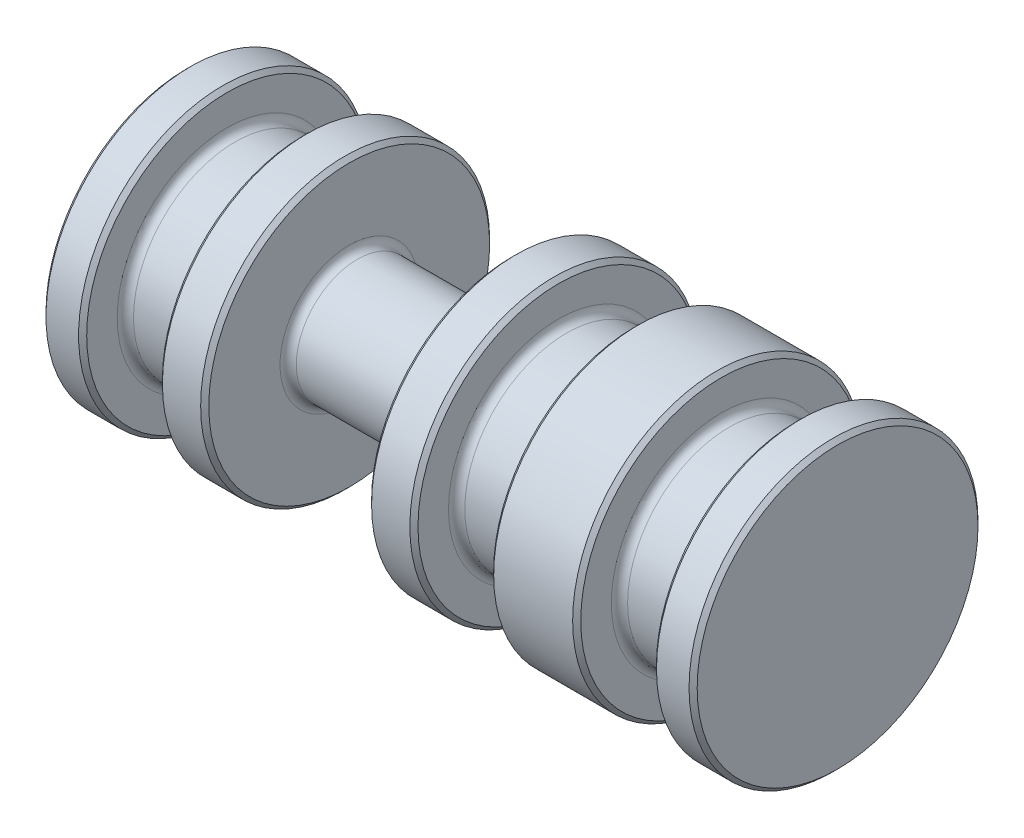
ISO-10303-21;
HEADER;
FILE_DESCRIPTION(('STEP AP214'),'2;1');
FILE_NAME('part.step','',(''),(''),'','','');
FILE_SCHEMA(('AUTOMOTIVE_DESIGN { 1 0 10303 214 1 1 1 1 }'));
ENDSEC;
DATA;
#1=APPLICATION_CONTEXT('core data for automotive mechanical design processes');
#2=APPLICATION_PROTOCOL_DEFINITION('international standard','automotive_design',2000,#1);
#3=PRODUCT_CONTEXT('',#1,'mechanical');
#4=PRODUCT('Part','Part','',(#3));
#5=PRODUCT_RELATED_PRODUCT_CATEGORY('part','',(#4));
#6=PRODUCT_DEFINITION_FORMATION('','',#4);
#7=PRODUCT_DEFINITION_CONTEXT('part definition',#1,'design');
#8=PRODUCT_DEFINITION('design','',#6,#7);
#9=PRODUCT_DEFINITION_SHAPE('','',#8);
#10=(LENGTH_UNIT() NAMED_UNIT(*) SI_UNIT(.MILLI.,.METRE.));
#11=(NAMED_UNIT(*) PLANE_ANGLE_UNIT() SI_UNIT($,.RADIAN.));
#12=(NAMED_UNIT(*) SI_UNIT($,.STERADIAN.) SOLID_ANGLE_UNIT());
#13=UNCERTAINTY_MEASURE_WITH_UNIT(LENGTH_MEASURE(1.E-05),#10,'distance_accuracy_value','');
#14=(GEOMETRIC_REPRESENTATION_CONTEXT(3) GLOBAL_UNCERTAINTY_ASSIGNED_CONTEXT((#13)) GLOBAL_UNIT_ASSIGNED_CONTEXT((#10,
#11,#12)) REPRESENTATION_CONTEXT('',''));
#15=CARTESIAN_POINT('',(0.,0.,0.));
#16=DIRECTION('',(0.,0.,1.));
#17=DIRECTION('',(1.,0.,0.));
#18=AXIS2_PLACEMENT_3D('',#15,#16,#17);
#19=CARTESIAN_POINT('',(20.32,0.,0.));
#20=DIRECTION('',(-1.,0.,0.));
#21=DIRECTION('',(0.,0.,1.));
#22=AXIS2_PLACEMENT_3D('',#19,#20,#21);
#23=CYLINDRICAL_SURFACE('',#22,4.5085);
#24=CARTESIAN_POINT('',(1.143,0.,0.));
#25=DIRECTION('',(1.,0.,0.));
#26=DIRECTION('',(0.,0.,-1.));
#27=AXIS2_PLACEMENT_3D('',#24,#25,#26);
#28=CIRCLE('',#27,4.5085);
#29=CARTESIAN_POINT('',(1.143,0.,-4.5085));
#30=VERTEX_POINT('',#29);
#31=EDGE_CURVE('E48',#30,#30,#28,.F.);
#32=ORIENTED_EDGE('',*,*,#31,.T.);
#33=EDGE_LOOP('',(#32));
#34=FACE_BOUND('',#33,.T.);
#35=CARTESIAN_POINT('',(0.126999999999999,0.,0.));
#36=DIRECTION('',(1.,0.,0.));
#37=DIRECTION('',(0.,0.,-1.));
#38=AXIS2_PLACEMENT_3D('',#35,#36,#37);
#39=CIRCLE('',#38,4.5085);
#40=CARTESIAN_POINT('',(0.126999999999999,0.,-4.5085));
#41=VERTEX_POINT('',#40);
#42=EDGE_CURVE('E92',#41,#41,#39,.T.);
#43=ORIENTED_EDGE('',*,*,#42,.T.);
#44=EDGE_LOOP('',(#43));
#45=FACE_BOUND('',#44,.T.);
#46=ADVANCED_FACE('F39',(#34,#45),#23,.T.);
#47=CARTESIAN_POINT('',(0.,0.,0.));
#48=DIRECTION('',(1.,0.,0.));
#49=DIRECTION('',(0.,0.,-1.));
#50=AXIS2_PLACEMENT_3D('',#47,#48,#49);
#51=PLANE('',#50);
#52=CARTESIAN_POINT('',(0.,0.,0.));
#53=DIRECTION('',(1.,0.,0.));
#54=DIRECTION('',(0.,0.,-1.));
#55=AXIS2_PLACEMENT_3D('',#52,#53,#54);
#56=CIRCLE('',#55,4.3815);
#57=CARTESIAN_POINT('',(0.,0.,-4.3815));
#58=VERTEX_POINT('',#57);
#59=EDGE_CURVE('E88',#58,#58,#56,.F.);
#60=ORIENTED_EDGE('',*,*,#59,.T.);
#61=EDGE_LOOP('',(#60));
#62=FACE_BOUND('',#61,.T.);
#63=ADVANCED_FACE('F222',(#62),#51,.F.);
#64=CARTESIAN_POINT('',(1.27,3.175,0.));
#65=DIRECTION('',(1.,0.,0.));
#66=DIRECTION('',(0.,0.,-1.));
#67=AXIS2_PLACEMENT_3D('',#64,#65,#66);
#68=PLANE('',#67);
#69=CARTESIAN_POINT('',(1.27,0.,0.));
#70=DIRECTION('',(1.,0.,0.));
#71=DIRECTION('',(0.,0.,-1.));
#72=AXIS2_PLACEMENT_3D('',#69,#70,#71);
#73=CIRCLE('',#72,4.3815);
#74=CARTESIAN_POINT('',(1.27,0.,-4.3815));
#75=VERTEX_POINT('',#74);
#76=EDGE_CURVE('E10',#75,#75,#73,.T.);
#77=ORIENTED_EDGE('',*,*,#76,.T.);
#78=EDGE_LOOP('',(#77));
#79=FACE_BOUND('',#78,.T.);
#80=CARTESIAN_POINT('',(1.27,0.,0.));
#81=DIRECTION('',(1.,0.,0.));
#82=DIRECTION('',(0.,0.,-1.));
#83=AXIS2_PLACEMENT_3D('',#80,#81,#82);
#84=CIRCLE('',#83,3.429);
#85=CARTESIAN_POINT('',(1.27,0.,-3.429));
#86=VERTEX_POINT('',#85);
#87=EDGE_CURVE('E128',#86,#86,#84,.F.);
#88=ORIENTED_EDGE('',*,*,#87,.T.);
#89=EDGE_LOOP('',(#88));
#90=FACE_BOUND('',#89,.T.);
#91=ADVANCED_FACE('F227',(#79,#90),#68,.T.);
#92=CARTESIAN_POINT('',(3.6322,4.5085,0.));
#93=DIRECTION('',(-1.,0.,0.));
#94=DIRECTION('',(0.,0.,1.));
#95=AXIS2_PLACEMENT_3D('',#92,#93,#94);
#96=PLANE('',#95);
#97=CARTESIAN_POINT('',(3.6322,0.,0.));
#98=DIRECTION('',(-1.,0.,0.));
#99=DIRECTION('',(0.,0.,1.));
#100=AXIS2_PLACEMENT_3D('',#97,#98,#99);
#101=CIRCLE('',#100,4.38150000000001);
#102=CARTESIAN_POINT('',(3.6322,0.,4.38150000000001));
#103=VERTEX_POINT('',#102);
#104=EDGE_CURVE('E100',#103,#103,#101,.T.);
#105=ORIENTED_EDGE('',*,*,#104,.T.);
#106=EDGE_LOOP('',(#105));
#107=FACE_BOUND('',#106,.T.);
#108=CARTESIAN_POINT('',(3.6322,0.,0.));
#109=DIRECTION('',(-1.,0.,0.));
#110=DIRECTION('',(0.,0.,1.));
#111=AXIS2_PLACEMENT_3D('',#108,#109,#110);
#112=CIRCLE('',#111,3.429);
#113=CARTESIAN_POINT('',(3.6322,0.,3.429));
#114=VERTEX_POINT('',#113);
#115=EDGE_CURVE('E132',#114,#114,#112,.F.);
#116=ORIENTED_EDGE('',*,*,#115,.T.);
#117=EDGE_LOOP('',(#116));
#118=FACE_BOUND('',#117,.T.);
#119=ADVANCED_FACE('F284',(#107,#118),#96,.T.);
#120=CARTESIAN_POINT('',(-1.61741962375833,0.,0.));
#121=DIRECTION('',(-1.,0.,0.));
#122=DIRECTION('',(0.,0.,1.));
#123=AXIS2_PLACEMENT_3D('',#120,#121,#122);
#124=CYLINDRICAL_SURFACE('',#123,3.175);
#125=CARTESIAN_POINT('',(3.3782,0.,0.));
#126=DIRECTION('',(-1.,0.,0.));
#127=DIRECTION('',(0.,0.,1.));
#128=AXIS2_PLACEMENT_3D('',#125,#126,#127);
#129=CIRCLE('',#128,3.175);
#130=CARTESIAN_POINT('',(3.3782,0.,3.175));
#131=VERTEX_POINT('',#130);
#132=EDGE_CURVE('E136',#131,#131,#129,.T.);
#133=ORIENTED_EDGE('',*,*,#132,.T.);
#134=EDGE_LOOP('',(#133));
#135=FACE_BOUND('',#134,.T.);
#136=CARTESIAN_POINT('',(1.524,0.,0.));
#137=DIRECTION('',(1.,0.,0.));
#138=DIRECTION('',(0.,0.,-1.));
#139=AXIS2_PLACEMENT_3D('',#136,#137,#138);
#140=CIRCLE('',#139,3.175);
#141=CARTESIAN_POINT('',(1.524,0.,-3.175));
#142=VERTEX_POINT('',#141);
#143=EDGE_CURVE('E140',#142,#142,#140,.T.);
#144=ORIENTED_EDGE('',*,*,#143,.T.);
#145=EDGE_LOOP('',(#144));
#146=FACE_BOUND('',#145,.T.);
#147=ADVANCED_FACE('F234',(#135,#146),#124,.T.);
#148=CARTESIAN_POINT('',(4.953,0.,0.));
#149=DIRECTION('',(1.,0.,0.));
#150=DIRECTION('',(0.,0.,-1.));
#151=AXIS2_PLACEMENT_3D('',#148,#149,#150);
#152=CIRCLE('',#151,4.5085);
#153=CARTESIAN_POINT('',(4.953,0.,-4.5085));
#154=VERTEX_POINT('',#153);
#155=EDGE_CURVE('E58',#154,#154,#152,.F.);
#156=ORIENTED_EDGE('',*,*,#155,.T.);
#157=EDGE_LOOP('',(#156));
#158=FACE_BOUND('',#157,.T.);
#159=CARTESIAN_POINT('',(3.7592,0.,0.));
#160=DIRECTION('',(-1.,0.,0.));
#161=DIRECTION('',(0.,0.,1.));
#162=AXIS2_PLACEMENT_3D('',#159,#160,#161);
#163=CIRCLE('',#162,4.5085);
#164=CARTESIAN_POINT('',(3.7592,0.,4.5085));
#165=VERTEX_POINT('',#164);
#166=EDGE_CURVE('E96',#165,#165,#163,.F.);
#167=ORIENTED_EDGE('',*,*,#166,.T.);
#168=EDGE_LOOP('',(#167));
#169=FACE_BOUND('',#168,.T.);
#170=ADVANCED_FACE('F219',(#158,#169),#23,.T.);
#171=CARTESIAN_POINT('',(5.08,4.5085,0.));
#172=DIRECTION('',(1.,0.,0.));
#173=DIRECTION('',(0.,0.,-1.));
#174=AXIS2_PLACEMENT_3D('',#171,#172,#173);
#175=PLANE('',#174);
#176=CARTESIAN_POINT('',(5.08,0.,0.));
#177=DIRECTION('',(1.,0.,0.));
#178=DIRECTION('',(0.,0.,-1.));
#179=AXIS2_PLACEMENT_3D('',#176,#177,#178);
#180=CIRCLE('',#179,4.3815);
#181=CARTESIAN_POINT('',(5.08,0.,-4.3815));
#182=VERTEX_POINT('',#181);
#183=EDGE_CURVE('E53',#182,#182,#180,.T.);
#184=ORIENTED_EDGE('',*,*,#183,.T.);
#185=EDGE_LOOP('',(#184));
#186=FACE_BOUND('',#185,.T.);
#187=CARTESIAN_POINT('',(5.08,0.,0.));
#188=DIRECTION('',(1.,0.,0.));
#189=DIRECTION('',(0.,0.,-1.));
#190=AXIS2_PLACEMENT_3D('',#187,#188,#189);
#191=CIRCLE('',#190,2.159);
#192=CARTESIAN_POINT('',(5.08,0.,-2.159));
#193=VERTEX_POINT('',#192);
#194=EDGE_CURVE('E144',#193,#193,#191,.F.);
#195=ORIENTED_EDGE('',*,*,#194,.T.);
#196=EDGE_LOOP('',(#195));
#197=FACE_BOUND('',#196,.T.);
#198=ADVANCED_FACE('F233',(#186,#197),#175,.T.);
#199=CARTESIAN_POINT('',(-1.61741962375833,0.,0.));
#200=DIRECTION('',(-1.,0.,0.));
#201=DIRECTION('',(0.,0.,1.));
#202=AXIS2_PLACEMENT_3D('',#199,#200,#201);
#203=CYLINDRICAL_SURFACE('',#202,1.905);
#204=CARTESIAN_POINT('',(9.906,0.,0.));
#205=DIRECTION('',(-1.,0.,0.));
#206=DIRECTION('',(0.,0.,1.));
#207=AXIS2_PLACEMENT_3D('',#204,#205,#206);
#208=CIRCLE('',#207,1.905);
#209=CARTESIAN_POINT('',(9.906,0.,1.905));
#210=VERTEX_POINT('',#209);
#211=EDGE_CURVE('E152',#210,#210,#208,.T.);
#212=ORIENTED_EDGE('',*,*,#211,.T.);
#213=EDGE_LOOP('',(#212));
#214=FACE_BOUND('',#213,.T.);
#215=CARTESIAN_POINT('',(5.334,0.,0.));
#216=DIRECTION('',(1.,0.,0.));
#217=DIRECTION('',(0.,0.,-1.));
#218=AXIS2_PLACEMENT_3D('',#215,#216,#217);
#219=CIRCLE('',#218,1.905);
#220=CARTESIAN_POINT('',(5.334,0.,-1.905));
#221=VERTEX_POINT('',#220);
#222=EDGE_CURVE('E156',#221,#221,#219,.T.);
#223=ORIENTED_EDGE('',*,*,#222,.T.);
#224=EDGE_LOOP('',(#223));
#225=FACE_BOUND('',#224,.T.);
#226=ADVANCED_FACE('F247',(#214,#225),#203,.T.);
#227=CARTESIAN_POINT('',(10.16,4.5085,0.));
#228=DIRECTION('',(-1.,0.,0.));
#229=DIRECTION('',(0.,0.,1.));
#230=AXIS2_PLACEMENT_3D('',#227,#228,#229);
#231=PLANE('',#230);
#232=CARTESIAN_POINT('',(10.16,0.,0.));
#233=DIRECTION('',(-1.,0.,0.));
#234=DIRECTION('',(0.,0.,1.));
#235=AXIS2_PLACEMENT_3D('',#232,#233,#234);
#236=CIRCLE('',#235,4.3815);
#237=CARTESIAN_POINT('',(10.16,0.,4.3815));
#238=VERTEX_POINT('',#237);
#239=EDGE_CURVE('E108',#238,#238,#236,.T.);
#240=ORIENTED_EDGE('',*,*,#239,.T.);
#241=EDGE_LOOP('',(#240));
#242=FACE_BOUND('',#241,.T.);
#243=CARTESIAN_POINT('',(10.16,0.,0.));
#244=DIRECTION('',(-1.,0.,0.));
#245=DIRECTION('',(0.,0.,1.));
#246=AXIS2_PLACEMENT_3D('',#243,#244,#245);
#247=CIRCLE('',#246,2.159);
#248=CARTESIAN_POINT('',(10.16,0.,2.159));
#249=VERTEX_POINT('',#248);
#250=EDGE_CURVE('E148',#249,#249,#247,.F.);
#251=ORIENTED_EDGE('',*,*,#250,.T.);
#252=EDGE_LOOP('',(#251));
#253=FACE_BOUND('',#252,.T.);
#254=ADVANCED_FACE('F238',(#242,#253),#231,.T.);
#255=CARTESIAN_POINT('',(11.4808,0.,0.));
#256=DIRECTION('',(1.,0.,0.));
#257=DIRECTION('',(0.,0.,-1.));
#258=AXIS2_PLACEMENT_3D('',#255,#256,#257);
#259=CIRCLE('',#258,4.5085);
#260=CARTESIAN_POINT('',(11.4808,0.,-4.5085));
#261=VERTEX_POINT('',#260);
#262=EDGE_CURVE('E68',#261,#261,#259,.F.);
#263=ORIENTED_EDGE('',*,*,#262,.T.);
#264=EDGE_LOOP('',(#263));
#265=FACE_BOUND('',#264,.T.);
#266=CARTESIAN_POINT('',(10.287,0.,0.));
#267=DIRECTION('',(-1.,0.,0.));
#268=DIRECTION('',(0.,0.,1.));
#269=AXIS2_PLACEMENT_3D('',#266,#267,#268);
#270=CIRCLE('',#269,4.5085);
#271=CARTESIAN_POINT('',(10.287,0.,4.5085));
#272=VERTEX_POINT('',#271);
#273=EDGE_CURVE('E104',#272,#272,#270,.F.);
#274=ORIENTED_EDGE('',*,*,#273,.T.);
#275=EDGE_LOOP('',(#274));
#276=FACE_BOUND('',#275,.T.);
#277=ADVANCED_FACE('F223',(#265,#276),#23,.T.);
#278=CARTESIAN_POINT('',(11.6078,3.175,0.));
#279=DIRECTION('',(1.,0.,0.));
#280=DIRECTION('',(0.,0.,-1.));
#281=AXIS2_PLACEMENT_3D('',#278,#279,#280);
#282=PLANE('',#281);
#283=CARTESIAN_POINT('',(11.6078,0.,0.));
#284=DIRECTION('',(1.,0.,0.));
#285=DIRECTION('',(0.,0.,-1.));
#286=AXIS2_PLACEMENT_3D('',#283,#284,#285);
#287=CIRCLE('',#286,4.38150000000001);
#288=CARTESIAN_POINT('',(11.6078,0.,-4.38150000000001));
#289=VERTEX_POINT('',#288);
#290=EDGE_CURVE('E64',#289,#289,#287,.T.);
#291=ORIENTED_EDGE('',*,*,#290,.T.);
#292=EDGE_LOOP('',(#291));
#293=FACE_BOUND('',#292,.T.);
#294=CARTESIAN_POINT('',(11.6078,0.,0.));
#295=DIRECTION('',(1.,0.,0.));
#296=DIRECTION('',(0.,0.,-1.));
#297=AXIS2_PLACEMENT_3D('',#294,#295,#296);
#298=CIRCLE('',#297,3.429);
#299=CARTESIAN_POINT('',(11.6078,0.,-3.429));
#300=VERTEX_POINT('',#299);
#301=EDGE_CURVE('E160',#300,#300,#298,.F.);
#302=ORIENTED_EDGE('',*,*,#301,.T.);
#303=EDGE_LOOP('',(#302));
#304=FACE_BOUND('',#303,.T.);
#305=ADVANCED_FACE('F237',(#293,#304),#282,.T.);
#306=CARTESIAN_POINT('',(13.97,4.5085,0.));
#307=DIRECTION('',(-1.,0.,0.));
#308=DIRECTION('',(0.,0.,1.));
#309=AXIS2_PLACEMENT_3D('',#306,#307,#308);
#310=PLANE('',#309);
#311=CARTESIAN_POINT('',(13.97,0.,0.));
#312=DIRECTION('',(-1.,0.,0.));
#313=DIRECTION('',(0.,0.,1.));
#314=AXIS2_PLACEMENT_3D('',#311,#312,#313);
#315=CIRCLE('',#314,4.3815);
#316=CARTESIAN_POINT('',(13.97,0.,4.3815));
#317=VERTEX_POINT('',#316);
#318=EDGE_CURVE('E116',#317,#317,#315,.T.);
#319=ORIENTED_EDGE('',*,*,#318,.T.);
#320=EDGE_LOOP('',(#319));
#321=FACE_BOUND('',#320,.T.);
#322=CARTESIAN_POINT('',(13.97,0.,0.));
#323=DIRECTION('',(-1.,0.,0.));
#324=DIRECTION('',(0.,0.,1.));
#325=AXIS2_PLACEMENT_3D('',#322,#323,#324);
#326=CIRCLE('',#325,3.429);
#327=CARTESIAN_POINT('',(13.97,0.,3.429));
#328=VERTEX_POINT('',#327);
#329=EDGE_CURVE('E164',#328,#328,#326,.F.);
#330=ORIENTED_EDGE('',*,*,#329,.T.);
#331=EDGE_LOOP('',(#330));
#332=FACE_BOUND('',#331,.T.);
#333=ADVANCED_FACE('F244',(#321,#332),#310,.T.);
#334=CARTESIAN_POINT('',(-1.61741962375833,0.,0.));
#335=DIRECTION('',(-1.,0.,0.));
#336=DIRECTION('',(0.,0.,1.));
#337=AXIS2_PLACEMENT_3D('',#334,#335,#336);
#338=CYLINDRICAL_SURFACE('',#337,3.175);
#339=CARTESIAN_POINT('',(13.716,0.,0.));
#340=DIRECTION('',(-1.,0.,0.));
#341=DIRECTION('',(0.,0.,1.));
#342=AXIS2_PLACEMENT_3D('',#339,#340,#341);
#343=CIRCLE('',#342,3.175);
#344=CARTESIAN_POINT('',(13.716,0.,3.175));
#345=VERTEX_POINT('',#344);
#346=EDGE_CURVE('E168',#345,#345,#343,.T.);
#347=ORIENTED_EDGE('',*,*,#346,.T.);
#348=EDGE_LOOP('',(#347));
#349=FACE_BOUND('',#348,.T.);
#350=CARTESIAN_POINT('',(11.8618,0.,0.));
#351=DIRECTION('',(1.,0.,0.));
#352=DIRECTION('',(0.,0.,-1.));
#353=AXIS2_PLACEMENT_3D('',#350,#351,#352);
#354=CIRCLE('',#353,3.175);
#355=CARTESIAN_POINT('',(11.8618,0.,-3.175));
#356=VERTEX_POINT('',#355);
#357=EDGE_CURVE('E172',#356,#356,#354,.T.);
#358=ORIENTED_EDGE('',*,*,#357,.T.);
#359=EDGE_LOOP('',(#358));
#360=FACE_BOUND('',#359,.T.);
#361=ADVANCED_FACE('F215',(#349,#360),#338,.T.);
#362=CARTESIAN_POINT('',(16.5608,0.,0.));
#363=DIRECTION('',(1.,0.,0.));
#364=DIRECTION('',(0.,0.,-1.));
#365=AXIS2_PLACEMENT_3D('',#362,#363,#364);
#366=CIRCLE('',#365,4.5085);
#367=CARTESIAN_POINT('',(16.5608,0.,-4.5085));
#368=VERTEX_POINT('',#367);
#369=EDGE_CURVE('E76',#368,#368,#366,.F.);
#370=ORIENTED_EDGE('',*,*,#369,.T.);
#371=EDGE_LOOP('',(#370));
#372=FACE_BOUND('',#371,.T.);
#373=CARTESIAN_POINT('',(14.097,0.,0.));
#374=DIRECTION('',(-1.,0.,0.));
#375=DIRECTION('',(0.,0.,1.));
#376=AXIS2_PLACEMENT_3D('',#373,#374,#375);
#377=CIRCLE('',#376,4.5085);
#378=CARTESIAN_POINT('',(14.097,0.,4.5085));
#379=VERTEX_POINT('',#378);
#380=EDGE_CURVE('E112',#379,#379,#377,.F.);
#381=ORIENTED_EDGE('',*,*,#380,.T.);
#382=EDGE_LOOP('',(#381));
#383=FACE_BOUND('',#382,.T.);
#384=ADVANCED_FACE('F206',(#372,#383),#23,.T.);
#385=CARTESIAN_POINT('',(16.6878,3.175,0.));
#386=DIRECTION('',(1.,0.,0.));
#387=DIRECTION('',(0.,0.,-1.));
#388=AXIS2_PLACEMENT_3D('',#385,#386,#387);
#389=PLANE('',#388);
#390=CARTESIAN_POINT('',(16.6878,0.,0.));
#391=DIRECTION('',(1.,0.,0.));
#392=DIRECTION('',(0.,0.,-1.));
#393=AXIS2_PLACEMENT_3D('',#390,#391,#392);
#394=CIRCLE('',#393,4.3815);
#395=CARTESIAN_POINT('',(16.6878,0.,-4.3815));
#396=VERTEX_POINT('',#395);
#397=EDGE_CURVE('E72',#396,#396,#394,.T.);
#398=ORIENTED_EDGE('',*,*,#397,.T.);
#399=EDGE_LOOP('',(#398));
#400=FACE_BOUND('',#399,.T.);
#401=CARTESIAN_POINT('',(16.6878,0.,0.));
#402=DIRECTION('',(1.,0.,0.));
#403=DIRECTION('',(0.,0.,-1.));
#404=AXIS2_PLACEMENT_3D('',#401,#402,#403);
#405=CIRCLE('',#404,3.429);
#406=CARTESIAN_POINT('',(16.6878,0.,-3.429));
#407=VERTEX_POINT('',#406);
#408=EDGE_CURVE('E176',#407,#407,#405,.F.);
#409=ORIENTED_EDGE('',*,*,#408,.T.);
#410=EDGE_LOOP('',(#409));
#411=FACE_BOUND('',#410,.T.);
#412=ADVANCED_FACE('F203',(#400,#411),#389,.T.);
#413=CARTESIAN_POINT('',(19.05,4.5085,0.));
#414=DIRECTION('',(-1.,0.,0.));
#415=DIRECTION('',(0.,0.,1.));
#416=AXIS2_PLACEMENT_3D('',#413,#414,#415);
#417=PLANE('',#416);
#418=CARTESIAN_POINT('',(19.05,0.,0.));
#419=DIRECTION('',(-1.,0.,0.));
#420=DIRECTION('',(0.,0.,1.));
#421=AXIS2_PLACEMENT_3D('',#418,#419,#420);
#422=CIRCLE('',#421,4.3815);
#423=CARTESIAN_POINT('',(19.05,0.,4.3815));
#424=VERTEX_POINT('',#423);
#425=EDGE_CURVE('E124',#424,#424,#422,.T.);
#426=ORIENTED_EDGE('',*,*,#425,.T.);
#427=EDGE_LOOP('',(#426));
#428=FACE_BOUND('',#427,.T.);
#429=CARTESIAN_POINT('',(19.05,0.,0.));
#430=DIRECTION('',(-1.,0.,0.));
#431=DIRECTION('',(0.,0.,1.));
#432=AXIS2_PLACEMENT_3D('',#429,#430,#431);
#433=CIRCLE('',#432,3.429);
#434=CARTESIAN_POINT('',(19.05,0.,3.429));
#435=VERTEX_POINT('',#434);
#436=EDGE_CURVE('E180',#435,#435,#433,.F.);
#437=ORIENTED_EDGE('',*,*,#436,.T.);
#438=EDGE_LOOP('',(#437));
#439=FACE_BOUND('',#438,.T.);
#440=ADVANCED_FACE('F205',(#428,#439),#417,.T.);
#441=CARTESIAN_POINT('',(-1.61741962375833,0.,0.));
#442=DIRECTION('',(-1.,0.,0.));
#443=DIRECTION('',(0.,0.,1.));
#444=AXIS2_PLACEMENT_3D('',#441,#442,#443);
#445=CYLINDRICAL_SURFACE('',#444,3.175);
#446=CARTESIAN_POINT('',(18.796,0.,0.));
#447=DIRECTION('',(-1.,0.,0.));
#448=DIRECTION('',(0.,0.,1.));
#449=AXIS2_PLACEMENT_3D('',#446,#447,#448);
#450=CIRCLE('',#449,3.175);
#451=CARTESIAN_POINT('',(18.796,0.,3.175));
#452=VERTEX_POINT('',#451);
#453=EDGE_CURVE('E184',#452,#452,#450,.T.);
#454=ORIENTED_EDGE('',*,*,#453,.T.);
#455=EDGE_LOOP('',(#454));
#456=FACE_BOUND('',#455,.T.);
#457=CARTESIAN_POINT('',(16.9418,0.,0.));
#458=DIRECTION('',(1.,0.,0.));
#459=DIRECTION('',(0.,0.,-1.));
#460=AXIS2_PLACEMENT_3D('',#457,#458,#459);
#461=CIRCLE('',#460,3.175);
#462=CARTESIAN_POINT('',(16.9418,0.,-3.175));
#463=VERTEX_POINT('',#462);
#464=EDGE_CURVE('E188',#463,#463,#461,.T.);
#465=ORIENTED_EDGE('',*,*,#464,.T.);
#466=EDGE_LOOP('',(#465));
#467=FACE_BOUND('',#466,.T.);
#468=ADVANCED_FACE('F193',(#456,#467),#445,.T.);
#469=CARTESIAN_POINT('',(20.32,0.,0.));
#470=DIRECTION('',(1.,0.,0.));
#471=DIRECTION('',(0.,0.,-1.));
#472=AXIS2_PLACEMENT_3D('',#469,#470,#471);
#473=PLANE('',#472);
#474=CARTESIAN_POINT('',(20.32,0.,0.));
#475=DIRECTION('',(1.,0.,0.));
#476=DIRECTION('',(0.,0.,-1.));
#477=AXIS2_PLACEMENT_3D('',#474,#475,#476);
#478=CIRCLE('',#477,4.3815);
#479=CARTESIAN_POINT('',(20.32,0.,-4.3815));
#480=VERTEX_POINT('',#479);
#481=EDGE_CURVE('E84',#480,#480,#478,.T.);
#482=ORIENTED_EDGE('',*,*,#481,.T.);
#483=EDGE_LOOP('',(#482));
#484=FACE_BOUND('',#483,.T.);
#485=ADVANCED_FACE('F252',(#484),#473,.T.);
#486=CARTESIAN_POINT('',(20.193,0.,0.));
#487=DIRECTION('',(1.,0.,0.));
#488=DIRECTION('',(0.,0.,-1.));
#489=AXIS2_PLACEMENT_3D('',#486,#487,#488);
#490=CIRCLE('',#489,4.5085);
#491=CARTESIAN_POINT('',(20.193,0.,-4.5085));
#492=VERTEX_POINT('',#491);
#493=EDGE_CURVE('E80',#492,#492,#490,.F.);
#494=ORIENTED_EDGE('',*,*,#493,.T.);
#495=EDGE_LOOP('',(#494));
#496=FACE_BOUND('',#495,.T.);
#497=CARTESIAN_POINT('',(19.177,0.,0.));
#498=DIRECTION('',(-1.,0.,0.));
#499=DIRECTION('',(0.,0.,1.));
#500=AXIS2_PLACEMENT_3D('',#497,#498,#499);
#501=CIRCLE('',#500,4.5085);
#502=CARTESIAN_POINT('',(19.177,0.,4.5085));
#503=VERTEX_POINT('',#502);
#504=EDGE_CURVE('E120',#503,#503,#501,.F.);
#505=ORIENTED_EDGE('',*,*,#504,.T.);
#506=EDGE_LOOP('',(#505));
#507=FACE_BOUND('',#506,.T.);
#508=ADVANCED_FACE('F218',(#496,#507),#23,.T.);
#509=CARTESIAN_POINT('',(18.796,0.,0.));
#510=DIRECTION('',(-1.,0.,0.));
#511=DIRECTION('',(0.,0.,1.));
#512=AXIS2_PLACEMENT_3D('',#509,#510,#511);
#513=TOROIDAL_SURFACE('',#512,3.429,0.254);
#514=ORIENTED_EDGE('',*,*,#436,.F.);
#515=EDGE_LOOP('',(#514));
#516=FACE_BOUND('',#515,.T.);
#517=ORIENTED_EDGE('',*,*,#453,.F.);
#518=EDGE_LOOP('',(#517));
#519=FACE_BOUND('',#518,.T.);
#520=ADVANCED_FACE('F199',(#516,#519),#513,.F.);
#521=CARTESIAN_POINT('',(16.9418,0.,0.));
#522=DIRECTION('',(1.,0.,0.));
#523=DIRECTION('',(0.,0.,-1.));
#524=AXIS2_PLACEMENT_3D('',#521,#522,#523);
#525=TOROIDAL_SURFACE('',#524,3.429,0.254);
#526=ORIENTED_EDGE('',*,*,#464,.F.);
#527=EDGE_LOOP('',(#526));
#528=FACE_BOUND('',#527,.T.);
#529=ORIENTED_EDGE('',*,*,#408,.F.);
#530=EDGE_LOOP('',(#529));
#531=FACE_BOUND('',#530,.T.);
#532=ADVANCED_FACE('F195',(#528,#531),#525,.F.);
#533=CARTESIAN_POINT('',(13.716,0.,0.));
#534=DIRECTION('',(-1.,0.,0.));
#535=DIRECTION('',(0.,0.,1.));
#536=AXIS2_PLACEMENT_3D('',#533,#534,#535);
#537=TOROIDAL_SURFACE('',#536,3.429,0.254);
#538=ORIENTED_EDGE('',*,*,#329,.F.);
#539=EDGE_LOOP('',(#538));
#540=FACE_BOUND('',#539,.T.);
#541=ORIENTED_EDGE('',*,*,#346,.F.);
#542=EDGE_LOOP('',(#541));
#543=FACE_BOUND('',#542,.T.);
#544=ADVANCED_FACE('F198',(#540,#543),#537,.F.);
#545=CARTESIAN_POINT('',(11.8618,0.,0.));
#546=DIRECTION('',(1.,0.,0.));
#547=DIRECTION('',(0.,0.,-1.));
#548=AXIS2_PLACEMENT_3D('',#545,#546,#547);
#549=TOROIDAL_SURFACE('',#548,3.429,0.254);
#550=ORIENTED_EDGE('',*,*,#357,.F.);
#551=EDGE_LOOP('',(#550));
#552=FACE_BOUND('',#551,.T.);
#553=ORIENTED_EDGE('',*,*,#301,.F.);
#554=EDGE_LOOP('',(#553));
#555=FACE_BOUND('',#554,.T.);
#556=ADVANCED_FACE('F392',(#552,#555),#549,.F.);
#557=CARTESIAN_POINT('',(9.906,0.,0.));
#558=DIRECTION('',(-1.,0.,0.));
#559=DIRECTION('',(0.,0.,1.));
#560=AXIS2_PLACEMENT_3D('',#557,#558,#559);
#561=TOROIDAL_SURFACE('',#560,2.159,0.254);
#562=ORIENTED_EDGE('',*,*,#250,.F.);
#563=EDGE_LOOP('',(#562));
#564=FACE_BOUND('',#563,.T.);
#565=ORIENTED_EDGE('',*,*,#211,.F.);
#566=EDGE_LOOP('',(#565));
#567=FACE_BOUND('',#566,.T.);
#568=ADVANCED_FACE('F387',(#564,#567),#561,.F.);
#569=CARTESIAN_POINT('',(5.334,0.,0.));
#570=DIRECTION('',(1.,0.,0.));
#571=DIRECTION('',(0.,0.,-1.));
#572=AXIS2_PLACEMENT_3D('',#569,#570,#571);
#573=TOROIDAL_SURFACE('',#572,2.159,0.254);
#574=ORIENTED_EDGE('',*,*,#222,.F.);
#575=EDGE_LOOP('',(#574));
#576=FACE_BOUND('',#575,.T.);
#577=ORIENTED_EDGE('',*,*,#194,.F.);
#578=EDGE_LOOP('',(#577));
#579=FACE_BOUND('',#578,.T.);
#580=ADVANCED_FACE('F305',(#576,#579),#573,.F.);
#581=CARTESIAN_POINT('',(3.3782,0.,0.));
#582=DIRECTION('',(-1.,0.,0.));
#583=DIRECTION('',(0.,0.,1.));
#584=AXIS2_PLACEMENT_3D('',#581,#582,#583);
#585=TOROIDAL_SURFACE('',#584,3.429,0.254);
#586=ORIENTED_EDGE('',*,*,#115,.F.);
#587=EDGE_LOOP('',(#586));
#588=FACE_BOUND('',#587,.T.);
#589=ORIENTED_EDGE('',*,*,#132,.F.);
#590=EDGE_LOOP('',(#589));
#591=FACE_BOUND('',#590,.T.);
#592=ADVANCED_FACE('F298',(#588,#591),#585,.F.);
#593=CARTESIAN_POINT('',(1.524,0.,0.));
#594=DIRECTION('',(1.,0.,0.));
#595=DIRECTION('',(0.,0.,-1.));
#596=AXIS2_PLACEMENT_3D('',#593,#594,#595);
#597=TOROIDAL_SURFACE('',#596,3.429,0.254);
#598=ORIENTED_EDGE('',*,*,#143,.F.);
#599=EDGE_LOOP('',(#598));
#600=FACE_BOUND('',#599,.T.);
#601=ORIENTED_EDGE('',*,*,#87,.F.);
#602=EDGE_LOOP('',(#601));
#603=FACE_BOUND('',#602,.T.);
#604=ADVANCED_FACE('F269',(#600,#603),#597,.F.);
#605=CARTESIAN_POINT('',(19.05,0.,0.));
#606=DIRECTION('',(1.,0.,0.));
#607=DIRECTION('',(0.,0.,-1.));
#608=AXIS2_PLACEMENT_3D('',#605,#606,#607);
#609=CONICAL_SURFACE('',#608,4.3815,0.785398163397452);
#610=ORIENTED_EDGE('',*,*,#504,.F.);
#611=EDGE_LOOP('',(#610));
#612=FACE_BOUND('',#611,.T.);
#613=ORIENTED_EDGE('',*,*,#425,.F.);
#614=EDGE_LOOP('',(#613));
#615=FACE_BOUND('',#614,.T.);
#616=ADVANCED_FACE('F265',(#612,#615),#609,.T.);
#617=CARTESIAN_POINT('',(13.97,0.,0.));
#618=DIRECTION('',(1.,0.,0.));
#619=DIRECTION('',(0.,0.,-1.));
#620=AXIS2_PLACEMENT_3D('',#617,#618,#619);
#621=CONICAL_SURFACE('',#620,4.3815,0.785398163397438);
#622=ORIENTED_EDGE('',*,*,#380,.F.);
#623=EDGE_LOOP('',(#622));
#624=FACE_BOUND('',#623,.T.);
#625=ORIENTED_EDGE('',*,*,#318,.F.);
#626=EDGE_LOOP('',(#625));
#627=FACE_BOUND('',#626,.T.);
#628=ADVANCED_FACE('F268',(#624,#627),#621,.T.);
#629=CARTESIAN_POINT('',(10.16,0.,0.));
#630=DIRECTION('',(1.,0.,0.));
#631=DIRECTION('',(0.,0.,-1.));
#632=AXIS2_PLACEMENT_3D('',#629,#630,#631);
#633=CONICAL_SURFACE('',#632,4.3815,0.785398163397438);
#634=ORIENTED_EDGE('',*,*,#273,.F.);
#635=EDGE_LOOP('',(#634));
#636=FACE_BOUND('',#635,.T.);
#637=ORIENTED_EDGE('',*,*,#239,.F.);
#638=EDGE_LOOP('',(#637));
#639=FACE_BOUND('',#638,.T.);
#640=ADVANCED_FACE('F319',(#636,#639),#633,.T.);
#641=CARTESIAN_POINT('',(3.6322,0.,0.));
#642=DIRECTION('',(1.,0.,0.));
#643=DIRECTION('',(0.,0.,-1.));
#644=AXIS2_PLACEMENT_3D('',#641,#642,#643);
#645=CONICAL_SURFACE('',#644,4.3815,0.785398163397424);
#646=ORIENTED_EDGE('',*,*,#166,.F.);
#647=EDGE_LOOP('',(#646));
#648=FACE_BOUND('',#647,.T.);
#649=ORIENTED_EDGE('',*,*,#104,.F.);
#650=EDGE_LOOP('',(#649));
#651=FACE_BOUND('',#650,.T.);
#652=ADVANCED_FACE('F326',(#648,#651),#645,.T.);
#653=CARTESIAN_POINT('',(0.126999999999999,0.,0.));
#654=DIRECTION('',(1.,0.,0.));
#655=DIRECTION('',(0.,0.,-1.));
#656=AXIS2_PLACEMENT_3D('',#653,#654,#655);
#657=CONICAL_SURFACE('',#656,4.5085,0.785398163397452);
#658=ORIENTED_EDGE('',*,*,#59,.F.);
#659=EDGE_LOOP('',(#658));
#660=FACE_BOUND('',#659,.T.);
#661=ORIENTED_EDGE('',*,*,#42,.F.);
#662=EDGE_LOOP('',(#661));
#663=FACE_BOUND('',#662,.T.);
#664=ADVANCED_FACE('F333',(#660,#663),#657,.T.);
#665=CARTESIAN_POINT('',(20.32,0.,0.));
#666=DIRECTION('',(-1.,0.,0.));
#667=DIRECTION('',(0.,0.,1.));
#668=AXIS2_PLACEMENT_3D('',#665,#666,#667);
#669=CONICAL_SURFACE('',#668,4.3815,0.785398163397445);
#670=ORIENTED_EDGE('',*,*,#493,.F.);
#671=EDGE_LOOP('',(#670));
#672=FACE_BOUND('',#671,.T.);
#673=ORIENTED_EDGE('',*,*,#481,.F.);
#674=EDGE_LOOP('',(#673));
#675=FACE_BOUND('',#674,.T.);
#676=ADVANCED_FACE('F340',(#672,#675),#669,.T.);
#677=CARTESIAN_POINT('',(16.5608,0.,0.));
#678=DIRECTION('',(-1.,0.,0.));
#679=DIRECTION('',(0.,0.,1.));
#680=AXIS2_PLACEMENT_3D('',#677,#678,#679);
#681=CONICAL_SURFACE('',#680,4.5085,0.785398163397438);
#682=ORIENTED_EDGE('',*,*,#397,.F.);
#683=EDGE_LOOP('',(#682));
#684=FACE_BOUND('',#683,.T.);
#685=ORIENTED_EDGE('',*,*,#369,.F.);
#686=EDGE_LOOP('',(#685));
#687=FACE_BOUND('',#686,.T.);
#688=ADVANCED_FACE('F347',(#684,#687),#681,.T.);
#689=CARTESIAN_POINT('',(11.4808,0.,0.));
#690=DIRECTION('',(-1.,0.,0.));
#691=DIRECTION('',(0.,0.,1.));
#692=AXIS2_PLACEMENT_3D('',#689,#690,#691);
#693=CONICAL_SURFACE('',#692,4.5085,0.785398163397431);
#694=ORIENTED_EDGE('',*,*,#290,.F.);
#695=EDGE_LOOP('',(#694));
#696=FACE_BOUND('',#695,.T.);
#697=ORIENTED_EDGE('',*,*,#262,.F.);
#698=EDGE_LOOP('',(#697));
#699=FACE_BOUND('',#698,.T.);
#700=ADVANCED_FACE('F354',(#696,#699),#693,.T.);
#701=CARTESIAN_POINT('',(4.953,0.,0.));
#702=DIRECTION('',(-1.,0.,0.));
#703=DIRECTION('',(0.,0.,1.));
#704=AXIS2_PLACEMENT_3D('',#701,#702,#703);
#705=CONICAL_SURFACE('',#704,4.5085,0.785398163397431);
#706=ORIENTED_EDGE('',*,*,#183,.F.);
#707=EDGE_LOOP('',(#706));
#708=FACE_BOUND('',#707,.T.);
#709=ORIENTED_EDGE('',*,*,#155,.F.);
#710=EDGE_LOOP('',(#709));
#711=FACE_BOUND('',#710,.T.);
#712=ADVANCED_FACE('F360',(#708,#711),#705,.T.);
#713=CARTESIAN_POINT('',(1.143,0.,0.));
#714=DIRECTION('',(-1.,0.,0.));
#715=DIRECTION('',(0.,0.,1.));
#716=AXIS2_PLACEMENT_3D('',#713,#714,#715);
#717=CONICAL_SURFACE('',#716,4.5085,0.785398163397438);
#718=ORIENTED_EDGE('',*,*,#76,.F.);
#719=EDGE_LOOP('',(#718));
#720=FACE_BOUND('',#719,.T.);
#721=ORIENTED_EDGE('',*,*,#31,.F.);
#722=EDGE_LOOP('',(#721));
#723=FACE_BOUND('',#722,.T.);
#724=ADVANCED_FACE('F42',(#720,#723),#717,.T.);
#725=CLOSED_SHELL('',(#46,#63,#91,#119,#147,#170,#198,#226,#254,#277,#305,#333,#361,#384,#412,
#440,#468,#485,#508,#520,#532,#544,#556,#568,#580,#592,#604,#616,#628,#640,#652,#664,#676,#688,
#700,#712,#724));
#726=MANIFOLD_SOLID_BREP('B2',#725);
#727=ADVANCED_BREP_SHAPE_REPRESENTATION('',(#18,#726),#14);
#728=SHAPE_DEFINITION_REPRESENTATION(#9,#727);
ENDSEC;
END-ISO-10303-21;
